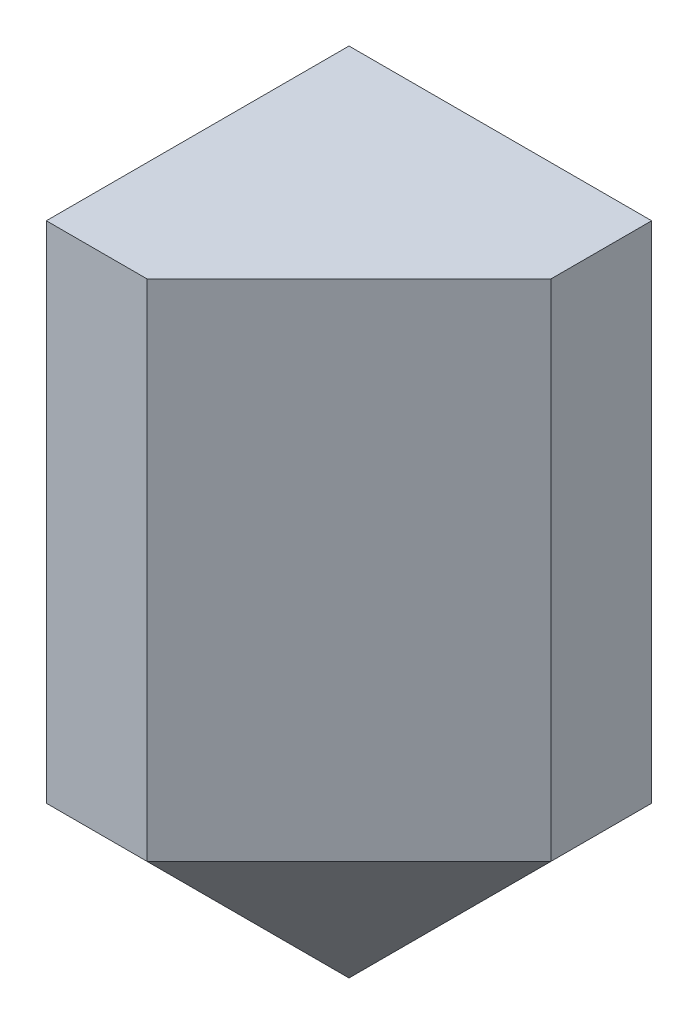
ISO-10303-21;
HEADER;
FILE_DESCRIPTION(('STEP AP214'),'2;1');
FILE_NAME('part.step','',(''),(''),'','','');
FILE_SCHEMA(('AUTOMOTIVE_DESIGN { 1 0 10303 214 1 1 1 1 }'));
ENDSEC;
DATA;
#1=APPLICATION_CONTEXT('core data for automotive mechanical design processes');
#2=APPLICATION_PROTOCOL_DEFINITION('international standard','automotive_design',2000,#1);
#3=PRODUCT_CONTEXT('',#1,'mechanical');
#4=PRODUCT('Part','Part','',(#3));
#5=PRODUCT_RELATED_PRODUCT_CATEGORY('part','',(#4));
#6=PRODUCT_DEFINITION_FORMATION('','',#4);
#7=PRODUCT_DEFINITION_CONTEXT('part definition',#1,'design');
#8=PRODUCT_DEFINITION('design','',#6,#7);
#9=PRODUCT_DEFINITION_SHAPE('','',#8);
#10=(LENGTH_UNIT() NAMED_UNIT(*) SI_UNIT(.MILLI.,.METRE.));
#11=(NAMED_UNIT(*) PLANE_ANGLE_UNIT() SI_UNIT($,.RADIAN.));
#12=(NAMED_UNIT(*) SI_UNIT($,.STERADIAN.) SOLID_ANGLE_UNIT());
#13=UNCERTAINTY_MEASURE_WITH_UNIT(LENGTH_MEASURE(1.E-05),#10,'distance_accuracy_value','');
#14=(GEOMETRIC_REPRESENTATION_CONTEXT(3) GLOBAL_UNCERTAINTY_ASSIGNED_CONTEXT((#13)) GLOBAL_UNIT_ASSIGNED_CONTEXT((#10,
#11,#12)) REPRESENTATION_CONTEXT('',''));
#15=CARTESIAN_POINT('',(0.,0.,0.));
#16=DIRECTION('',(0.,0.,1.));
#17=DIRECTION('',(1.,0.,0.));
#18=AXIS2_PLACEMENT_3D('',#15,#16,#17);
#19=CARTESIAN_POINT('',(0.,0.,30.));
#20=DIRECTION('',(1.,0.,0.));
#21=DIRECTION('',(0.,0.,-1.));
#22=AXIS2_PLACEMENT_3D('',#19,#20,#21);
#23=PLANE('',#22);
#24=CARTESIAN_POINT('',(0.,55.,15.));
#25=DIRECTION('',(-1.,0.,0.));
#26=DIRECTION('',(0.,0.,1.));
#27=AXIS2_PLACEMENT_3D('',#24,#25,#26);
#28=CIRCLE('',#27,7.5);
#29=CARTESIAN_POINT('',(0.,55.,22.5));
#30=VERTEX_POINT('',#29);
#31=EDGE_CURVE('E117',#30,#30,#28,.T.);
#32=ORIENTED_EDGE('',*,*,#31,.F.);
#33=EDGE_LOOP('',(#32));
#34=FACE_BOUND('',#33,.T.);
#35=CARTESIAN_POINT('',(0.,20.,18.));
#36=DIRECTION('',(-1.,0.,0.));
#37=DIRECTION('',(0.,0.,1.));
#38=AXIS2_PLACEMENT_3D('',#35,#36,#37);
#39=CIRCLE('',#38,2.75);
#40=CARTESIAN_POINT('',(0.,20.,20.75));
#41=VERTEX_POINT('',#40);
#42=EDGE_CURVE('E140',#41,#41,#39,.T.);
#43=ORIENTED_EDGE('',*,*,#42,.F.);
#44=EDGE_LOOP('',(#43));
#45=FACE_BOUND('',#44,.T.);
#46=DIRECTION('',(0.,0.,-1.));
#47=VECTOR('',#46,1.);
#48=CARTESIAN_POINT('',(0.,0.,30.));
#49=LINE('',#48,#47);
#50=CARTESIAN_POINT('',(0.,0.,9.99999999999995));
#51=VERTEX_POINT('',#50);
#52=CARTESIAN_POINT('',(0.,0.,0.));
#53=VERTEX_POINT('',#52);
#54=EDGE_CURVE('E165',#51,#53,#49,.T.);
#55=ORIENTED_EDGE('',*,*,#54,.F.);
#56=DIRECTION('',(0.,-0.707106781186546,-0.707106781186549));
#57=VECTOR('',#56,1.);
#58=CARTESIAN_POINT('',(0.,20.,30.));
#59=LINE('',#58,#57);
#60=CARTESIAN_POINT('',(0.,20.,30.));
#61=VERTEX_POINT('',#60);
#62=EDGE_CURVE('E11',#51,#61,#59,.F.);
#63=ORIENTED_EDGE('',*,*,#62,.T.);
#64=DIRECTION('',(0.,-1.,0.));
#65=VECTOR('',#64,1.);
#66=CARTESIAN_POINT('',(0.,0.,30.));
#67=LINE('',#66,#65);
#68=CARTESIAN_POINT('',(0.,70.,30.));
#69=VERTEX_POINT('',#68);
#70=EDGE_CURVE('E162',#69,#61,#67,.T.);
#71=ORIENTED_EDGE('',*,*,#70,.F.);
#72=DIRECTION('',(0.,0.,1.));
#73=VECTOR('',#72,1.);
#74=CARTESIAN_POINT('',(0.,70.,30.));
#75=LINE('',#74,#73);
#76=CARTESIAN_POINT('',(0.,70.,0.));
#77=VERTEX_POINT('',#76);
#78=EDGE_CURVE('E146',#77,#69,#75,.T.);
#79=ORIENTED_EDGE('',*,*,#78,.F.);
#80=DIRECTION('',(0.,-1.,0.));
#81=VECTOR('',#80,1.);
#82=CARTESIAN_POINT('',(0.,0.,0.));
#83=LINE('',#82,#81);
#84=EDGE_CURVE('E167',#77,#53,#83,.T.);
#85=ORIENTED_EDGE('',*,*,#84,.T.);
#86=EDGE_LOOP('',(#55,#63,#71,#79,#85));
#87=FACE_BOUND('',#86,.T.);
#88=ADVANCED_FACE('F41',(#34,#45,#87),#23,.F.);
#89=CARTESIAN_POINT('',(0.,0.,30.));
#90=DIRECTION('',(0.,1.,0.));
#91=DIRECTION('',(0.,0.,1.));
#92=AXIS2_PLACEMENT_3D('',#89,#90,#91);
#93=PLANE('',#92);
#94=DIRECTION('',(1.,0.,0.));
#95=VECTOR('',#94,1.);
#96=CARTESIAN_POINT('',(0.,0.,0.));
#97=LINE('',#96,#95);
#98=CARTESIAN_POINT('',(9.99999999999995,0.,0.));
#99=VERTEX_POINT('',#98);
#100=EDGE_CURVE('E170',#53,#99,#97,.T.);
#101=ORIENTED_EDGE('',*,*,#100,.T.);
#102=DIRECTION('',(0.,0.,1.));
#103=VECTOR('',#102,1.);
#104=CARTESIAN_POINT('',(9.99999999999995,0.,30.));
#105=LINE('',#104,#103);
#106=CARTESIAN_POINT('',(9.99999999999995,0.,9.99999999999995));
#107=VERTEX_POINT('',#106);
#108=EDGE_CURVE('E51',#99,#107,#105,.T.);
#109=ORIENTED_EDGE('',*,*,#108,.T.);
#110=DIRECTION('',(-1.,0.,0.));
#111=VECTOR('',#110,1.);
#112=CARTESIAN_POINT('',(0.,0.,9.99999999999995));
#113=LINE('',#112,#111);
#114=EDGE_CURVE('E62',#107,#51,#113,.T.);
#115=ORIENTED_EDGE('',*,*,#114,.T.);
#116=ORIENTED_EDGE('',*,*,#54,.T.);
#117=EDGE_LOOP('',(#101,#109,#115,#116));
#118=FACE_BOUND('',#117,.T.);
#119=ADVANCED_FACE('F223',(#118),#93,.F.);
#120=CARTESIAN_POINT('',(30.,0.,30.));
#121=DIRECTION('',(-1.,0.,0.));
#122=DIRECTION('',(0.,0.,1.));
#123=AXIS2_PLACEMENT_3D('',#120,#121,#122);
#124=PLANE('',#123);
#125=DIRECTION('',(0.,1.,0.));
#126=VECTOR('',#125,1.);
#127=CARTESIAN_POINT('',(30.,0.,0.));
#128=LINE('',#127,#126);
#129=CARTESIAN_POINT('',(30.,20.,0.));
#130=VERTEX_POINT('',#129);
#131=CARTESIAN_POINT('',(30.,70.,0.));
#132=VERTEX_POINT('',#131);
#133=EDGE_CURVE('E166',#130,#132,#128,.T.);
#134=ORIENTED_EDGE('',*,*,#133,.T.);
#135=DIRECTION('',(0.,0.,-1.));
#136=VECTOR('',#135,1.);
#137=CARTESIAN_POINT('',(30.,70.,0.));
#138=LINE('',#137,#136);
#139=CARTESIAN_POINT('',(30.,70.,9.99999999999992));
#140=VERTEX_POINT('',#139);
#141=EDGE_CURVE('E155',#140,#132,#138,.T.);
#142=ORIENTED_EDGE('',*,*,#141,.F.);
#143=DIRECTION('',(0.,-1.,0.));
#144=VECTOR('',#143,1.);
#145=CARTESIAN_POINT('',(30.,0.,9.99999999999995));
#146=LINE('',#145,#144);
#147=CARTESIAN_POINT('',(30.,20.,9.99999999999995));
#148=VERTEX_POINT('',#147);
#149=EDGE_CURVE('E180',#140,#148,#146,.T.);
#150=ORIENTED_EDGE('',*,*,#149,.T.);
#151=DIRECTION('',(0.,0.,-1.));
#152=VECTOR('',#151,1.);
#153=CARTESIAN_POINT('',(30.,20.,30.));
#154=LINE('',#153,#152);
#155=EDGE_CURVE('E178',#148,#130,#154,.T.);
#156=ORIENTED_EDGE('',*,*,#155,.T.);
#157=EDGE_LOOP('',(#134,#142,#150,#156));
#158=FACE_BOUND('',#157,.T.);
#159=ADVANCED_FACE('F229',(#158),#124,.F.);
#160=CARTESIAN_POINT('',(0.,0.,30.));
#161=DIRECTION('',(0.,0.,-1.));
#162=DIRECTION('',(-1.,0.,0.));
#163=AXIS2_PLACEMENT_3D('',#160,#161,#162);
#164=PLANE('',#163);
#165=DIRECTION('',(1.,0.,0.));
#166=VECTOR('',#165,1.);
#167=CARTESIAN_POINT('',(0.,20.,30.));
#168=LINE('',#167,#166);
#169=CARTESIAN_POINT('',(10.,20.,30.));
#170=VERTEX_POINT('',#169);
#171=EDGE_CURVE('E174',#61,#170,#168,.T.);
#172=ORIENTED_EDGE('',*,*,#171,.T.);
#173=DIRECTION('',(0.,1.,0.));
#174=VECTOR('',#173,1.);
#175=CARTESIAN_POINT('',(10.,0.,30.));
#176=LINE('',#175,#174);
#177=CARTESIAN_POINT('',(9.99999999999999,70.,30.));
#178=VERTEX_POINT('',#177);
#179=EDGE_CURVE('E176',#170,#178,#176,.T.);
#180=ORIENTED_EDGE('',*,*,#179,.T.);
#181=DIRECTION('',(1.,0.,0.));
#182=VECTOR('',#181,1.);
#183=CARTESIAN_POINT('',(9.99999999999999,70.,30.));
#184=LINE('',#183,#182);
#185=EDGE_CURVE('E149',#69,#178,#184,.T.);
#186=ORIENTED_EDGE('',*,*,#185,.F.);
#187=ORIENTED_EDGE('',*,*,#70,.T.);
#188=EDGE_LOOP('',(#172,#180,#186,#187));
#189=FACE_BOUND('',#188,.T.);
#190=ADVANCED_FACE('F203',(#189),#164,.F.);
#191=CARTESIAN_POINT('',(0.,0.,0.));
#192=DIRECTION('',(0.,0.,-1.));
#193=DIRECTION('',(-1.,0.,0.));
#194=AXIS2_PLACEMENT_3D('',#191,#192,#193);
#195=PLANE('',#194);
#196=CARTESIAN_POINT('',(14.,48.,0.));
#197=DIRECTION('',(0.,0.,-1.));
#198=DIRECTION('',(-1.,0.,0.));
#199=AXIS2_PLACEMENT_3D('',#196,#197,#198);
#200=CIRCLE('',#199,2.74999999999999);
#201=CARTESIAN_POINT('',(11.25,48.,0.));
#202=VERTEX_POINT('',#201);
#203=EDGE_CURVE('E127',#202,#202,#200,.T.);
#204=ORIENTED_EDGE('',*,*,#203,.F.);
#205=EDGE_LOOP('',(#204));
#206=FACE_BOUND('',#205,.T.);
#207=CARTESIAN_POINT('',(14.,20.,0.));
#208=DIRECTION('',(0.,0.,-1.));
#209=DIRECTION('',(-1.,0.,0.));
#210=AXIS2_PLACEMENT_3D('',#207,#208,#209);
#211=CIRCLE('',#210,2.74999999999999);
#212=CARTESIAN_POINT('',(11.25,20.,0.));
#213=VERTEX_POINT('',#212);
#214=EDGE_CURVE('E134',#213,#213,#211,.T.);
#215=ORIENTED_EDGE('',*,*,#214,.F.);
#216=EDGE_LOOP('',(#215));
#217=FACE_BOUND('',#216,.T.);
#218=ORIENTED_EDGE('',*,*,#133,.F.);
#219=DIRECTION('',(0.707106781186549,0.707106781186546,0.));
#220=VECTOR('',#219,1.);
#221=CARTESIAN_POINT('',(4.99999999999996,-4.99999999999997,0.));
#222=LINE('',#221,#220);
#223=EDGE_CURVE('E182',#130,#99,#222,.F.);
#224=ORIENTED_EDGE('',*,*,#223,.T.);
#225=ORIENTED_EDGE('',*,*,#100,.F.);
#226=ORIENTED_EDGE('',*,*,#84,.F.);
#227=DIRECTION('',(-1.,0.,0.));
#228=VECTOR('',#227,1.);
#229=CARTESIAN_POINT('',(0.,70.,0.));
#230=LINE('',#229,#228);
#231=EDGE_CURVE('E158',#132,#77,#230,.T.);
#232=ORIENTED_EDGE('',*,*,#231,.F.);
#233=EDGE_LOOP('',(#218,#224,#225,#226,#232));
#234=FACE_BOUND('',#233,.T.);
#235=ADVANCED_FACE('F220',(#206,#217,#234),#195,.T.);
#236=CARTESIAN_POINT('',(30.,20.,30.));
#237=DIRECTION('',(-0.707106781186546,0.707106781186549,0.));
#238=DIRECTION('',(0.,0.,-1.));
#239=AXIS2_PLACEMENT_3D('',#236,#237,#238);
#240=PLANE('',#239);
#241=ORIENTED_EDGE('',*,*,#223,.F.);
#242=ORIENTED_EDGE('',*,*,#155,.F.);
#243=DIRECTION('',(-0.707106781186549,-0.707106781186546,0.));
#244=VECTOR('',#243,1.);
#245=CARTESIAN_POINT('',(30.,20.,9.99999999999995));
#246=LINE('',#245,#244);
#247=EDGE_CURVE('E46',#107,#148,#246,.F.);
#248=ORIENTED_EDGE('',*,*,#247,.F.);
#249=ORIENTED_EDGE('',*,*,#108,.F.);
#250=EDGE_LOOP('',(#241,#242,#248,#249));
#251=FACE_BOUND('',#250,.T.);
#252=ADVANCED_FACE('F44',(#251),#240,.F.);
#253=CARTESIAN_POINT('',(0.,20.,30.));
#254=DIRECTION('',(0.,0.707106781186549,-0.707106781186546));
#255=DIRECTION('',(1.,0.,0.));
#256=AXIS2_PLACEMENT_3D('',#253,#254,#255);
#257=PLANE('',#256);
#258=ORIENTED_EDGE('',*,*,#62,.F.);
#259=ORIENTED_EDGE('',*,*,#114,.F.);
#260=DIRECTION('',(0.,0.707106781186546,0.707106781186549));
#261=VECTOR('',#260,1.);
#262=CARTESIAN_POINT('',(9.99999999999998,10.,20.));
#263=LINE('',#262,#261);
#264=EDGE_CURVE('E187',#170,#107,#263,.F.);
#265=ORIENTED_EDGE('',*,*,#264,.F.);
#266=ORIENTED_EDGE('',*,*,#171,.F.);
#267=EDGE_LOOP('',(#258,#259,#265,#266));
#268=FACE_BOUND('',#267,.T.);
#269=ADVANCED_FACE('F213',(#268),#257,.F.);
#270=CARTESIAN_POINT('',(30.,20.,9.99999999999995));
#271=DIRECTION('',(0.577350269189626,-0.577350269189628,0.577350269189624));
#272=DIRECTION('',(0.707106781186549,0.707106781186546,0.));
#273=AXIS2_PLACEMENT_3D('',#270,#271,#272);
#274=PLANE('',#273);
#275=ORIENTED_EDGE('',*,*,#264,.T.);
#276=ORIENTED_EDGE('',*,*,#247,.T.);
#277=DIRECTION('',(0.707106781186546,0.,-0.707106781186549));
#278=VECTOR('',#277,1.);
#279=CARTESIAN_POINT('',(30.,20.,9.99999999999995));
#280=LINE('',#279,#278);
#281=EDGE_CURVE('E161',#170,#148,#280,.T.);
#282=ORIENTED_EDGE('',*,*,#281,.F.);
#283=EDGE_LOOP('',(#275,#276,#282));
#284=FACE_BOUND('',#283,.T.);
#285=ADVANCED_FACE('F194',(#284),#274,.T.);
#286=CARTESIAN_POINT('',(10.,0.,30.));
#287=DIRECTION('',(-0.707106781186549,0.,-0.707106781186546));
#288=DIRECTION('',(0.,1.,0.));
#289=AXIS2_PLACEMENT_3D('',#286,#287,#288);
#290=PLANE('',#289);
#291=ORIENTED_EDGE('',*,*,#281,.T.);
#292=ORIENTED_EDGE('',*,*,#149,.F.);
#293=DIRECTION('',(0.707106781186546,0.,-0.707106781186549));
#294=VECTOR('',#293,1.);
#295=CARTESIAN_POINT('',(30.,70.,9.99999999999992));
#296=LINE('',#295,#294);
#297=EDGE_CURVE('E152',#178,#140,#296,.T.);
#298=ORIENTED_EDGE('',*,*,#297,.F.);
#299=ORIENTED_EDGE('',*,*,#179,.F.);
#300=EDGE_LOOP('',(#291,#292,#298,#299));
#301=FACE_BOUND('',#300,.T.);
#302=ADVANCED_FACE('F199',(#301),#290,.F.);
#303=CARTESIAN_POINT('',(0.,70.,0.));
#304=DIRECTION('',(0.,-1.,0.));
#305=DIRECTION('',(0.,0.,-1.));
#306=AXIS2_PLACEMENT_3D('',#303,#304,#305);
#307=PLANE('',#306);
#308=ORIENTED_EDGE('',*,*,#78,.T.);
#309=ORIENTED_EDGE('',*,*,#185,.T.);
#310=ORIENTED_EDGE('',*,*,#297,.T.);
#311=ORIENTED_EDGE('',*,*,#141,.T.);
#312=ORIENTED_EDGE('',*,*,#231,.T.);
#313=EDGE_LOOP('',(#308,#309,#310,#311,#312));
#314=FACE_BOUND('',#313,.T.);
#315=ADVANCED_FACE('F206',(#314),#307,.F.);
#316=CARTESIAN_POINT('',(13.,20.,18.));
#317=DIRECTION('',(-1.,0.,0.));
#318=DIRECTION('',(0.,0.,1.));
#319=AXIS2_PLACEMENT_3D('',#316,#317,#318);
#320=CONICAL_SURFACE('',#319,2.75,1.02974425867665);
#321=CARTESIAN_POINT('',(14.6523667023258,20.,18.));
#322=VERTEX_POINT('',#321);
#323=VERTEX_LOOP('',#322);
#324=FACE_BOUND('',#323,.T.);
#325=CARTESIAN_POINT('',(13.,20.,18.));
#326=DIRECTION('',(-1.,0.,0.));
#327=DIRECTION('',(0.,0.,1.));
#328=AXIS2_PLACEMENT_3D('',#325,#326,#327);
#329=CIRCLE('',#328,2.75);
#330=CARTESIAN_POINT('',(13.,20.,20.75));
#331=VERTEX_POINT('',#330);
#332=EDGE_CURVE('E143',#331,#331,#329,.T.);
#333=ORIENTED_EDGE('',*,*,#332,.T.);
#334=EDGE_LOOP('',(#333));
#335=FACE_BOUND('',#334,.T.);
#336=ADVANCED_FACE('F249',(#324,#335),#320,.F.);
#337=CARTESIAN_POINT('',(0.,20.,18.));
#338=DIRECTION('',(-1.,0.,0.));
#339=DIRECTION('',(0.,0.,1.));
#340=AXIS2_PLACEMENT_3D('',#337,#338,#339);
#341=CYLINDRICAL_SURFACE('',#340,2.75);
#342=ORIENTED_EDGE('',*,*,#332,.F.);
#343=EDGE_LOOP('',(#342));
#344=FACE_BOUND('',#343,.T.);
#345=ORIENTED_EDGE('',*,*,#42,.T.);
#346=EDGE_LOOP('',(#345));
#347=FACE_BOUND('',#346,.T.);
#348=ADVANCED_FACE('F254',(#344,#347),#341,.F.);
#349=CARTESIAN_POINT('',(14.,20.,13.));
#350=DIRECTION('',(0.,0.,-1.));
#351=DIRECTION('',(-1.,0.,0.));
#352=AXIS2_PLACEMENT_3D('',#349,#350,#351);
#353=CONICAL_SURFACE('',#352,2.75,1.02974425867665);
#354=CARTESIAN_POINT('',(14.,20.,14.6523667023258));
#355=VERTEX_POINT('',#354);
#356=VERTEX_LOOP('',#355);
#357=FACE_BOUND('',#356,.T.);
#358=CARTESIAN_POINT('',(14.,20.,13.));
#359=DIRECTION('',(0.,0.,-1.));
#360=DIRECTION('',(-1.,0.,0.));
#361=AXIS2_PLACEMENT_3D('',#358,#359,#360);
#362=CIRCLE('',#361,2.75);
#363=CARTESIAN_POINT('',(11.25,20.,13.));
#364=VERTEX_POINT('',#363);
#365=EDGE_CURVE('E137',#364,#364,#362,.T.);
#366=ORIENTED_EDGE('',*,*,#365,.T.);
#367=EDGE_LOOP('',(#366));
#368=FACE_BOUND('',#367,.T.);
#369=ADVANCED_FACE('F421',(#357,#368),#353,.F.);
#370=CARTESIAN_POINT('',(14.,20.,0.));
#371=DIRECTION('',(0.,0.,-1.));
#372=DIRECTION('',(-1.,0.,0.));
#373=AXIS2_PLACEMENT_3D('',#370,#371,#372);
#374=CYLINDRICAL_SURFACE('',#373,2.74999999999999);
#375=ORIENTED_EDGE('',*,*,#365,.F.);
#376=EDGE_LOOP('',(#375));
#377=FACE_BOUND('',#376,.T.);
#378=ORIENTED_EDGE('',*,*,#214,.T.);
#379=EDGE_LOOP('',(#378));
#380=FACE_BOUND('',#379,.T.);
#381=ADVANCED_FACE('F412',(#377,#380),#374,.F.);
#382=CARTESIAN_POINT('',(14.,48.,13.));
#383=DIRECTION('',(0.,0.,-1.));
#384=DIRECTION('',(-1.,0.,0.));
#385=AXIS2_PLACEMENT_3D('',#382,#383,#384);
#386=CONICAL_SURFACE('',#385,2.75,1.02974425867665);
#387=CARTESIAN_POINT('',(14.,48.,14.6523667023258));
#388=VERTEX_POINT('',#387);
#389=VERTEX_LOOP('',#388);
#390=FACE_BOUND('',#389,.T.);
#391=CARTESIAN_POINT('',(14.,48.,13.));
#392=DIRECTION('',(0.,0.,-1.));
#393=DIRECTION('',(-1.,0.,0.));
#394=AXIS2_PLACEMENT_3D('',#391,#392,#393);
#395=CIRCLE('',#394,2.75);
#396=CARTESIAN_POINT('',(11.25,48.,13.));
#397=VERTEX_POINT('',#396);
#398=EDGE_CURVE('E131',#397,#397,#395,.T.);
#399=ORIENTED_EDGE('',*,*,#398,.T.);
#400=EDGE_LOOP('',(#399));
#401=FACE_BOUND('',#400,.T.);
#402=ADVANCED_FACE('F403',(#390,#401),#386,.F.);
#403=CARTESIAN_POINT('',(14.,48.,0.));
#404=DIRECTION('',(0.,0.,-1.));
#405=DIRECTION('',(-1.,0.,0.));
#406=AXIS2_PLACEMENT_3D('',#403,#404,#405);
#407=CYLINDRICAL_SURFACE('',#406,2.74999999999999);
#408=ORIENTED_EDGE('',*,*,#398,.F.);
#409=EDGE_LOOP('',(#408));
#410=FACE_BOUND('',#409,.T.);
#411=ORIENTED_EDGE('',*,*,#203,.T.);
#412=EDGE_LOOP('',(#411));
#413=FACE_BOUND('',#412,.T.);
#414=ADVANCED_FACE('F355',(#410,#413),#407,.F.);
#415=CARTESIAN_POINT('',(3.,55.,15.));
#416=DIRECTION('',(-1.,0.,0.));
#417=DIRECTION('',(0.,0.,1.));
#418=AXIS2_PLACEMENT_3D('',#415,#416,#417);
#419=CYLINDRICAL_SURFACE('',#418,7.5);
#420=CARTESIAN_POINT('',(3.,55.,15.));
#421=DIRECTION('',(-1.,0.,0.));
#422=DIRECTION('',(0.,0.,1.));
#423=AXIS2_PLACEMENT_3D('',#420,#421,#422);
#424=CIRCLE('',#423,7.5);
#425=CARTESIAN_POINT('',(3.,55.,22.5));
#426=VERTEX_POINT('',#425);
#427=EDGE_CURVE('E121',#426,#426,#424,.T.);
#428=ORIENTED_EDGE('',*,*,#427,.F.);
#429=EDGE_LOOP('',(#428));
#430=FACE_BOUND('',#429,.T.);
#431=ORIENTED_EDGE('',*,*,#31,.T.);
#432=EDGE_LOOP('',(#431));
#433=FACE_BOUND('',#432,.T.);
#434=ADVANCED_FACE('F360',(#430,#433),#419,.F.);
#435=CARTESIAN_POINT('',(3.,55.,15.));
#436=DIRECTION('',(-1.,0.,0.));
#437=DIRECTION('',(0.,0.,1.));
#438=AXIS2_PLACEMENT_3D('',#435,#436,#437);
#439=PLANE('',#438);
#440=CARTESIAN_POINT('',(3.,55.,15.));
#441=DIRECTION('',(-1.,0.,0.));
#442=DIRECTION('',(0.,0.,1.));
#443=AXIS2_PLACEMENT_3D('',#440,#441,#442);
#444=CIRCLE('',#443,2.19999999999999);
#445=CARTESIAN_POINT('',(3.,55.,17.2));
#446=VERTEX_POINT('',#445);
#447=EDGE_CURVE('E118',#446,#446,#444,.T.);
#448=ORIENTED_EDGE('',*,*,#447,.F.);
#449=EDGE_LOOP('',(#448));
#450=FACE_BOUND('',#449,.T.);
#451=ORIENTED_EDGE('',*,*,#427,.T.);
#452=EDGE_LOOP('',(#451));
#453=FACE_BOUND('',#452,.T.);
#454=ADVANCED_FACE('F111',(#450,#453),#439,.T.);
#455=CARTESIAN_POINT('',(13.,55.,15.));
#456=DIRECTION('',(-1.,0.,0.));
#457=DIRECTION('',(0.,0.,1.));
#458=AXIS2_PLACEMENT_3D('',#455,#456,#457);
#459=CONICAL_SURFACE('',#458,2.19999999999999,1.02974425867665);
#460=CARTESIAN_POINT('',(14.3218933618606,55.,15.));
#461=VERTEX_POINT('',#460);
#462=VERTEX_LOOP('',#461);
#463=FACE_BOUND('',#462,.T.);
#464=CARTESIAN_POINT('',(13.,55.,15.));
#465=DIRECTION('',(-1.,0.,0.));
#466=DIRECTION('',(0.,0.,1.));
#467=AXIS2_PLACEMENT_3D('',#464,#465,#466);
#468=CIRCLE('',#467,2.19999999999999);
#469=CARTESIAN_POINT('',(13.,55.,17.2));
#470=VERTEX_POINT('',#469);
#471=EDGE_CURVE('E115',#470,#470,#468,.T.);
#472=ORIENTED_EDGE('',*,*,#471,.T.);
#473=EDGE_LOOP('',(#472));
#474=FACE_BOUND('',#473,.T.);
#475=ADVANCED_FACE('F107',(#463,#474),#459,.F.);
#476=CARTESIAN_POINT('',(3.,55.,15.));
#477=DIRECTION('',(-1.,0.,0.));
#478=DIRECTION('',(0.,0.,1.));
#479=AXIS2_PLACEMENT_3D('',#476,#477,#478);
#480=CYLINDRICAL_SURFACE('',#479,2.19999999999999);
#481=ORIENTED_EDGE('',*,*,#471,.F.);
#482=EDGE_LOOP('',(#481));
#483=FACE_BOUND('',#482,.T.);
#484=ORIENTED_EDGE('',*,*,#447,.T.);
#485=EDGE_LOOP('',(#484));
#486=FACE_BOUND('',#485,.T.);
#487=ADVANCED_FACE('F110',(#483,#486),#480,.F.);
#488=CLOSED_SHELL('',(#88,#119,#159,#190,#235,#252,#269,#285,#302,#315,#336,#348,#369,#381,#402,
#414,#434,#454,#475,#487));
#489=MANIFOLD_SOLID_BREP('B2',#488);
#490=ADVANCED_BREP_SHAPE_REPRESENTATION('',(#18,#489),#14);
#491=SHAPE_DEFINITION_REPRESENTATION(#9,#490);
ENDSEC;
END-ISO-10303-21;
